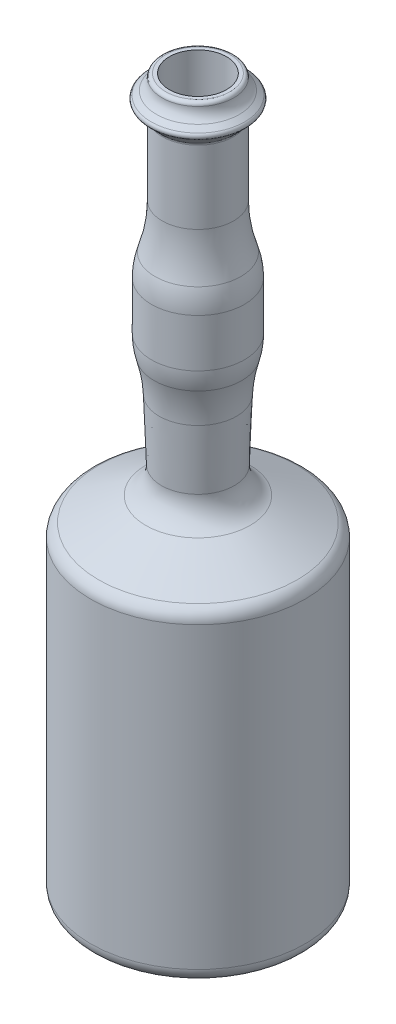
ISO-10303-21;
HEADER;
FILE_DESCRIPTION(('STEP AP214'),'2;1');
FILE_NAME('part.step','',(''),(''),'','','');
FILE_SCHEMA(('AUTOMOTIVE_DESIGN { 1 0 10303 214 1 1 1 1 }'));
ENDSEC;
DATA;
#1=APPLICATION_CONTEXT('core data for automotive mechanical design processes');
#2=APPLICATION_PROTOCOL_DEFINITION('international standard','automotive_design',2000,#1);
#3=PRODUCT_CONTEXT('',#1,'mechanical');
#4=PRODUCT('Part','Part','',(#3));
#5=PRODUCT_RELATED_PRODUCT_CATEGORY('part','',(#4));
#6=PRODUCT_DEFINITION_FORMATION('','',#4);
#7=PRODUCT_DEFINITION_CONTEXT('part definition',#1,'design');
#8=PRODUCT_DEFINITION('design','',#6,#7);
#9=PRODUCT_DEFINITION_SHAPE('','',#8);
#10=(LENGTH_UNIT() NAMED_UNIT(*) SI_UNIT(.MILLI.,.METRE.));
#11=(NAMED_UNIT(*) PLANE_ANGLE_UNIT() SI_UNIT($,.RADIAN.));
#12=(NAMED_UNIT(*) SI_UNIT($,.STERADIAN.) SOLID_ANGLE_UNIT());
#13=UNCERTAINTY_MEASURE_WITH_UNIT(LENGTH_MEASURE(1.E-05),#10,'distance_accuracy_value','');
#14=(GEOMETRIC_REPRESENTATION_CONTEXT(3) GLOBAL_UNCERTAINTY_ASSIGNED_CONTEXT((#13)) GLOBAL_UNIT_ASSIGNED_CONTEXT((#10,
#11,#12)) REPRESENTATION_CONTEXT('',''));
#15=CARTESIAN_POINT('',(0.,0.,0.));
#16=DIRECTION('',(0.,0.,1.));
#17=DIRECTION('',(1.,0.,0.));
#18=AXIS2_PLACEMENT_3D('',#15,#16,#17);
#19=CARTESIAN_POINT('',(0.,0.,0.));
#20=DIRECTION('',(0.,1.,0.));
#21=DIRECTION('',(0.,0.,1.));
#22=AXIS2_PLACEMENT_3D('',#19,#20,#21);
#23=PLANE('',#22);
#24=CARTESIAN_POINT('',(0.,0.,0.));
#25=DIRECTION('',(0.,1.,0.));
#26=DIRECTION('',(0.,0.,1.));
#27=AXIS2_PLACEMENT_3D('',#24,#25,#26);
#28=CIRCLE('',#27,13.);
#29=CARTESIAN_POINT('',(0.,0.,13.));
#30=VERTEX_POINT('',#29);
#31=EDGE_CURVE('E190',#30,#30,#28,.F.);
#32=ORIENTED_EDGE('',*,*,#31,.T.);
#33=EDGE_LOOP('',(#32));
#34=FACE_BOUND('',#33,.T.);
#35=ADVANCED_FACE('F61',(#34),#23,.F.);
#36=CARTESIAN_POINT('',(0.,0.,0.));
#37=DIRECTION('',(0.,1.,0.));
#38=DIRECTION('',(0.,0.,1.));
#39=AXIS2_PLACEMENT_3D('',#36,#37,#38);
#40=CYLINDRICAL_SURFACE('',#39,15.);
#41=CARTESIAN_POINT('',(0.,43.7639320225002,0.));
#42=DIRECTION('',(0.,-1.,0.));
#43=DIRECTION('',(0.,0.,-1.));
#44=AXIS2_PLACEMENT_3D('',#41,#42,#43);
#45=CIRCLE('',#44,15.);
#46=CARTESIAN_POINT('',(0.,43.7639320225002,-15.));
#47=VERTEX_POINT('',#46);
#48=EDGE_CURVE('E194',#47,#47,#45,.T.);
#49=ORIENTED_EDGE('',*,*,#48,.T.);
#50=EDGE_LOOP('',(#49));
#51=FACE_BOUND('',#50,.T.);
#52=CARTESIAN_POINT('',(0.,2.,0.));
#53=DIRECTION('',(0.,1.,0.));
#54=DIRECTION('',(0.,0.,1.));
#55=AXIS2_PLACEMENT_3D('',#52,#53,#54);
#56=CIRCLE('',#55,15.);
#57=CARTESIAN_POINT('',(0.,2.,15.));
#58=VERTEX_POINT('',#57);
#59=EDGE_CURVE('E229',#58,#58,#56,.T.);
#60=ORIENTED_EDGE('',*,*,#59,.T.);
#61=EDGE_LOOP('',(#60));
#62=FACE_BOUND('',#61,.T.);
#63=ADVANCED_FACE('F151',(#51,#62),#40,.T.);
#64=CARTESIAN_POINT('',(0.,50.,0.));
#65=DIRECTION('',(0.,-1.,0.));
#66=DIRECTION('',(0.,0.,-1.));
#67=AXIS2_PLACEMENT_3D('',#64,#65,#66);
#68=CONICAL_SURFACE('',#67,5.,1.10714871779409);
#69=CARTESIAN_POINT('',(0.,48.8498036512811,0.));
#70=DIRECTION('',(0.,-1.,0.));
#71=DIRECTION('',(0.,0.,-1.));
#72=AXIS2_PLACEMENT_3D('',#69,#70,#71);
#73=CIRCLE('',#72,7.30039269743788);
#74=CARTESIAN_POINT('',(0.,48.8498036512811,-7.30039269743788));
#75=VERTEX_POINT('',#74);
#76=EDGE_CURVE('E185',#75,#75,#73,.T.);
#77=ORIENTED_EDGE('',*,*,#76,.T.);
#78=EDGE_LOOP('',(#77));
#79=FACE_BOUND('',#78,.T.);
#80=CARTESIAN_POINT('',(0.,45.5527864045,0.));
#81=DIRECTION('',(0.,1.,0.));
#82=DIRECTION('',(0.,0.,1.));
#83=AXIS2_PLACEMENT_3D('',#80,#81,#82);
#84=CIRCLE('',#83,13.8944271909999);
#85=CARTESIAN_POINT('',(0.,45.5527864045,13.8944271909999));
#86=VERTEX_POINT('',#85);
#87=EDGE_CURVE('E227',#86,#86,#84,.T.);
#88=ORIENTED_EDGE('',*,*,#87,.T.);
#89=EDGE_LOOP('',(#88));
#90=FACE_BOUND('',#89,.T.);
#91=ADVANCED_FACE('F157',(#79,#90),#68,.T.);
#92=CARTESIAN_POINT('',(0.,50.,0.));
#93=DIRECTION('',(0.,1.,0.));
#94=DIRECTION('',(0.,0.,1.));
#95=AXIS2_PLACEMENT_3D('',#92,#93,#94);
#96=CONICAL_SURFACE('',#95,5.,0.0356991126793239);
#97=CARTESIAN_POINT('',(0.,61.1216545078617,0.));
#98=DIRECTION('',(0.,1.,0.));
#99=DIRECTION('',(0.,0.,1.));
#100=AXIS2_PLACEMENT_3D('',#97,#98,#99);
#101=CIRCLE('',#100,5.39720194670935);
#102=CARTESIAN_POINT('',(0.,61.1216545078617,5.39720194670935));
#103=VERTEX_POINT('',#102);
#104=EDGE_CURVE('E192',#103,#103,#101,.F.);
#105=ORIENTED_EDGE('',*,*,#104,.T.);
#106=EDGE_LOOP('',(#105));
#107=FACE_BOUND('',#106,.T.);
#108=CARTESIAN_POINT('',(0.,52.5702785373304,0.));
#109=DIRECTION('',(0.,1.,0.));
#110=DIRECTION('',(0.,0.,1.));
#111=AXIS2_PLACEMENT_3D('',#108,#109,#110);
#112=CIRCLE('',#111,5.09179566204751);
#113=CARTESIAN_POINT('',(0.,52.5702785373304,5.09179566204751));
#114=VERTEX_POINT('',#113);
#115=EDGE_CURVE('E188',#114,#114,#112,.T.);
#116=ORIENTED_EDGE('',*,*,#115,.T.);
#117=EDGE_LOOP('',(#116));
#118=FACE_BOUND('',#117,.T.);
#119=ADVANCED_FACE('F168',(#107,#118),#96,.T.);
#120=CARTESIAN_POINT('',(0.,43.7639320225002,0.));
#121=DIRECTION('',(0.,-1.,0.));
#122=DIRECTION('',(0.,0.,-1.));
#123=AXIS2_PLACEMENT_3D('',#120,#121,#122);
#124=TOROIDAL_SURFACE('',#123,13.,2.);
#125=ORIENTED_EDGE('',*,*,#48,.F.);
#126=EDGE_LOOP('',(#125));
#127=FACE_BOUND('',#126,.T.);
#128=ORIENTED_EDGE('',*,*,#87,.F.);
#129=EDGE_LOOP('',(#128));
#130=FACE_BOUND('',#129,.T.);
#131=ADVANCED_FACE('F164',(#127,#130),#124,.T.);
#132=CARTESIAN_POINT('',(0.,2.,0.));
#133=DIRECTION('',(0.,1.,0.));
#134=DIRECTION('',(0.,0.,1.));
#135=AXIS2_PLACEMENT_3D('',#132,#133,#134);
#136=TOROIDAL_SURFACE('',#135,13.,2.);
#137=ORIENTED_EDGE('',*,*,#31,.F.);
#138=EDGE_LOOP('',(#137));
#139=FACE_BOUND('',#138,.T.);
#140=ORIENTED_EDGE('',*,*,#59,.F.);
#141=EDGE_LOOP('',(#140));
#142=FACE_BOUND('',#141,.T.);
#143=ADVANCED_FACE('F167',(#139,#142),#136,.T.);
#144=CARTESIAN_POINT('',(0.,67.,0.));
#145=DIRECTION('',(0.,1.,0.));
#146=DIRECTION('',(0.,0.,1.));
#147=AXIS2_PLACEMENT_3D('',#144,#145,#146);
#148=CYLINDRICAL_SURFACE('',#147,6.5);
#149=CARTESIAN_POINT('',(0.,68.5126389067792,0.));
#150=DIRECTION('',(0.,-1.,0.));
#151=DIRECTION('',(0.,0.,-1.));
#152=AXIS2_PLACEMENT_3D('',#149,#150,#151);
#153=CIRCLE('',#152,6.5);
#154=CARTESIAN_POINT('',(0.,68.5126389067792,-6.5));
#155=VERTEX_POINT('',#154);
#156=EDGE_CURVE('E68',#155,#155,#153,.F.);
#157=ORIENTED_EDGE('',*,*,#156,.T.);
#158=EDGE_LOOP('',(#157));
#159=FACE_BOUND('',#158,.T.);
#160=CARTESIAN_POINT('',(0.,75.2318450791878,0.));
#161=DIRECTION('',(0.,-1.,0.));
#162=DIRECTION('',(0.,0.,-1.));
#163=AXIS2_PLACEMENT_3D('',#160,#161,#162);
#164=CIRCLE('',#163,6.5);
#165=CARTESIAN_POINT('',(0.,75.2318450791878,-6.5));
#166=VERTEX_POINT('',#165);
#167=EDGE_CURVE('E96',#166,#166,#164,.T.);
#168=ORIENTED_EDGE('',*,*,#167,.T.);
#169=EDGE_LOOP('',(#168));
#170=FACE_BOUND('',#169,.T.);
#171=ADVANCED_FACE('F171',(#159,#170),#148,.T.);
#172=CARTESIAN_POINT('',(0.,52.4275124152807,0.));
#173=DIRECTION('',(0.,1.,0.));
#174=DIRECTION('',(0.,0.,1.));
#175=AXIS2_PLACEMENT_3D('',#172,#173,#174);
#176=TOROIDAL_SURFACE('',#175,9.08924707943771,4.);
#177=ORIENTED_EDGE('',*,*,#76,.F.);
#178=EDGE_LOOP('',(#177));
#179=FACE_BOUND('',#178,.T.);
#180=ORIENTED_EDGE('',*,*,#115,.F.);
#181=EDGE_LOOP('',(#180));
#182=FACE_BOUND('',#181,.T.);
#183=ADVANCED_FACE('F173',(#179,#182),#176,.F.);
#184=CARTESIAN_POINT('',(0.,60.4078238976134,0.));
#185=DIRECTION('',(0.,1.,0.));
#186=DIRECTION('',(0.,0.,1.));
#187=AXIS2_PLACEMENT_3D('',#184,#185,#186);
#188=TOROIDAL_SURFACE('',#187,25.3844590336603,20.);
#189=CARTESIAN_POINT('',(0.,65.8110339037239,0.));
#190=DIRECTION('',(0.,-1.,0.));
#191=DIRECTION('',(0.,0.,-1.));
#192=AXIS2_PLACEMENT_3D('',#189,#190,#191);
#193=CIRCLE('',#192,6.12815301122012);
#194=CARTESIAN_POINT('',(0.,65.8110339037239,-6.12815301122012));
#195=VERTEX_POINT('',#194);
#196=EDGE_CURVE('E11',#195,#195,#193,.T.);
#197=ORIENTED_EDGE('',*,*,#196,.T.);
#198=EDGE_LOOP('',(#197));
#199=FACE_BOUND('',#198,.T.);
#200=ORIENTED_EDGE('',*,*,#104,.F.);
#201=EDGE_LOOP('',(#200));
#202=FACE_BOUND('',#201,.T.);
#203=ADVANCED_FACE('F122',(#199,#202),#188,.F.);
#204=CARTESIAN_POINT('',(0.,80.,0.));
#205=DIRECTION('',(0.,1.,0.));
#206=DIRECTION('',(0.,0.,1.));
#207=AXIS2_PLACEMENT_3D('',#204,#205,#206);
#208=CYLINDRICAL_SURFACE('',#207,5.);
#209=CARTESIAN_POINT('',(0.,94.8044922111821,0.));
#210=DIRECTION('',(0.,1.,0.));
#211=DIRECTION('',(0.,0.,1.));
#212=AXIS2_PLACEMENT_3D('',#209,#210,#211);
#213=CIRCLE('',#212,5.);
#214=CARTESIAN_POINT('',(0.,94.8044922111821,5.));
#215=VERTEX_POINT('',#214);
#216=EDGE_CURVE('E76',#215,#215,#213,.F.);
#217=ORIENTED_EDGE('',*,*,#216,.T.);
#218=EDGE_LOOP('',(#217));
#219=FACE_BOUND('',#218,.T.);
#220=CARTESIAN_POINT('',(0.,84.5993420767853,0.));
#221=DIRECTION('',(0.,1.,0.));
#222=DIRECTION('',(0.,0.,1.));
#223=AXIS2_PLACEMENT_3D('',#220,#221,#222);
#224=CIRCLE('',#223,5.);
#225=CARTESIAN_POINT('',(0.,84.5993420767853,5.));
#226=VERTEX_POINT('',#225);
#227=EDGE_CURVE('E102',#226,#226,#224,.T.);
#228=ORIENTED_EDGE('',*,*,#227,.T.);
#229=EDGE_LOOP('',(#228));
#230=FACE_BOUND('',#229,.T.);
#231=ADVANCED_FACE('F120',(#219,#230),#208,.T.);
#232=CARTESIAN_POINT('',(0.,84.5993420767853,0.));
#233=DIRECTION('',(0.,-1.,0.));
#234=DIRECTION('',(0.,0.,-1.));
#235=AXIS2_PLACEMENT_3D('',#232,#233,#234);
#236=TOROIDAL_SURFACE('',#235,25.,20.);
#237=CARTESIAN_POINT('',(0.,78.354344078387,0.));
#238=DIRECTION('',(0.,1.,0.));
#239=DIRECTION('',(0.,0.,1.));
#240=AXIS2_PLACEMENT_3D('',#237,#238,#239);
#241=CIRCLE('',#240,6.);
#242=CARTESIAN_POINT('',(0.,78.354344078387,6.));
#243=VERTEX_POINT('',#242);
#244=EDGE_CURVE('E99',#243,#243,#241,.T.);
#245=ORIENTED_EDGE('',*,*,#244,.T.);
#246=EDGE_LOOP('',(#245));
#247=FACE_BOUND('',#246,.T.);
#248=ORIENTED_EDGE('',*,*,#227,.F.);
#249=EDGE_LOOP('',(#248));
#250=FACE_BOUND('',#249,.T.);
#251=ADVANCED_FACE('F109',(#247,#250),#236,.F.);
#252=CARTESIAN_POINT('',(0.,75.2318450791878,0.));
#253=DIRECTION('',(0.,-1.,0.));
#254=DIRECTION('',(0.,0.,-1.));
#255=AXIS2_PLACEMENT_3D('',#252,#253,#254);
#256=DEGENERATE_TOROIDAL_SURFACE('',#255,3.5,10.,.F.);
#257=ORIENTED_EDGE('',*,*,#167,.F.);
#258=EDGE_LOOP('',(#257));
#259=FACE_BOUND('',#258,.T.);
#260=ORIENTED_EDGE('',*,*,#244,.F.);
#261=EDGE_LOOP('',(#260));
#262=FACE_BOUND('',#261,.T.);
#263=ADVANCED_FACE('F119',(#259,#262),#256,.F.);
#264=CARTESIAN_POINT('',(6.95787828317773,97.,-0.766765802891455));
#265=CARTESIAN_POINT('',(4.96911137244617,95.,0.554916361469131));
#266=CARTESIAN_POINT('',(8.49140988896064,97.,13.148990763464));
#267=CARTESIAN_POINT('',(3.85927864950791,95.,10.4931391063615));
#268=CARTESIAN_POINT('',(-5.42434667739482,97.,14.6825223692469));
#269=CARTESIAN_POINT('',(-6.07894409538443,95.,9.38330638342321));
#270=CARTESIAN_POINT('',(-6.95787828317773,97.,0.766765802891455));
#271=CARTESIAN_POINT('',(-4.96911137244617,95.,-0.554916361469132));
#272=CARTESIAN_POINT('',(-8.49140988896064,97.,-13.148990763464));
#273=CARTESIAN_POINT('',(-3.85927864950791,95.,-10.4931391063615));
#274=CARTESIAN_POINT('',(5.42434667739482,97.,-14.6825223692469));
#275=CARTESIAN_POINT('',(6.07894409538443,95.,-9.38330638342321));
#276=CARTESIAN_POINT('',(6.95787828317773,97.,-0.766765802891455));
#277=CARTESIAN_POINT('',(4.96911137244617,95.,0.554916361469131));
#278=(BOUNDED_SURFACE() B_SPLINE_SURFACE(3,1,((#264,#265),(#266,#267),(#268,#269),(#270,#271),
(#272,#273),(#274,#275),(#276,#277)),.UNSPECIFIED.,.T.,.F.,.F.) B_SPLINE_SURFACE_WITH_KNOTS((4,
3,4),(2,2),(0.,0.5,1.),(0.,1.),
.UNSPECIFIED.) GEOMETRIC_REPRESENTATION_ITEM() RATIONAL_B_SPLINE_SURFACE(((1.,1.),
(0.333333333333333,0.333333333333333),(0.333333333333333,0.333333333333333),(1.,1.),
(0.333333333333333,0.333333333333333),(0.333333333333333,0.333333333333333),(1.,1.))) REPRESENTATION_ITEM('') SURFACE());
#279=CARTESIAN_POINT('',(0.,96.5941117168195,0.));
#280=DIRECTION('',(0.,-1.,0.));
#281=DIRECTION('',(0.,0.,-1.));
#282=AXIS2_PLACEMENT_3D('',#279,#280,#281);
#283=CIRCLE('',#282,6.57320252634436);
#284=CARTESIAN_POINT('',(6.55426968965621,96.5941117168195,-0.498538150590147));
#285=VERTEX_POINT('',#284);
#286=EDGE_CURVE('E81',#285,#285,#283,.T.);
#287=CARTESIAN_POINT('',(0.,95.1452598366395,0.));
#288=DIRECTION('',(0.,-1.,0.));
#289=DIRECTION('',(0.,0.,-1.));
#290=AXIS2_PLACEMENT_3D('',#287,#288,#289);
#291=CIRCLE('',#290,5.13410735804045);
#292=CARTESIAN_POINT('',(5.11355535072966,95.1452598366395,0.458922693826928));
#293=VERTEX_POINT('',#292);
#294=EDGE_CURVE('E84',#293,#293,#291,.F.);
#295=CARTESIAN_POINT('',(6.55426968965621,96.5941117168195,-0.498538150590147));
#296=CARTESIAN_POINT('',(6.53926224862572,96.5790195097343,-0.488564600127468));
#297=CARTESIAN_POINT('',(6.52425480759524,96.5639273026491,-0.478591049664791));
#298=CARTESIAN_POINT('',(6.49423992553427,96.5337428884787,-0.458643948739436));
#299=CARTESIAN_POINT('',(6.47923248450379,96.5186506813935,-0.448670398276759));
#300=CARTESIAN_POINT('',(6.44921760244282,96.488466267223,-0.428723297351402));
#301=CARTESIAN_POINT('',(6.43421016141233,96.4733740601378,-0.418749746888723));
#302=CARTESIAN_POINT('',(6.40419527935136,96.4431896459674,-0.398802645963367));
#303=CARTESIAN_POINT('',(6.38918783832088,96.4280974388822,-0.388829095500691));
#304=CARTESIAN_POINT('',(6.35917295625991,96.3979130247118,-0.368881994575336));
#305=CARTESIAN_POINT('',(6.34416551522942,96.3828208176266,-0.358908444112658));
#306=CARTESIAN_POINT('',(6.31415063316845,96.3526364034562,-0.338961343187301));
#307=CARTESIAN_POINT('',(6.29914319213797,96.337544196371,-0.328987792724623));
#308=CARTESIAN_POINT('',(6.269128310077,96.3073597822005,-0.309040691799267));
#309=CARTESIAN_POINT('',(6.25412086904651,96.2922675751153,-0.29906714133659));
#310=CARTESIAN_POINT('',(6.22410598698554,96.2620831609449,-0.279120040411235));
#311=CARTESIAN_POINT('',(6.20909854595506,96.2469909538597,-0.269146489948556));
#312=CARTESIAN_POINT('',(6.17908366389409,96.2168065396893,-0.2491993890232));
#313=CARTESIAN_POINT('',(6.1640762228636,96.2017143326041,-0.239225838560522));
#314=CARTESIAN_POINT('',(6.13406134080263,96.1715299184337,-0.219278737635168));
#315=CARTESIAN_POINT('',(6.11905389977215,96.1564377113485,-0.20930518717249));
#316=CARTESIAN_POINT('',(6.08903901771118,96.1262532971781,-0.189358086247133));
#317=CARTESIAN_POINT('',(6.07403157668069,96.1111610900928,-0.179384535784454));
#318=CARTESIAN_POINT('',(6.04401669461972,96.0809766759224,-0.159437434859099));
#319=CARTESIAN_POINT('',(6.02900925358924,96.0658844688372,-0.149463884396423));
#320=CARTESIAN_POINT('',(5.99899437152827,96.0357000546668,-0.129516783471067));
#321=CARTESIAN_POINT('',(5.98398693049778,96.0206078475816,-0.119543233008387));
#322=CARTESIAN_POINT('',(5.95397204843681,95.9904234334112,-0.0995961320830312));
#323=CARTESIAN_POINT('',(5.93896460740633,95.975331226326,-0.0896225816203554));
#324=CARTESIAN_POINT('',(5.90894972534536,95.9451468121555,-0.0696754806950009));
#325=CARTESIAN_POINT('',(5.89394228431488,95.9300546050703,-0.0597019302323221));
#326=CARTESIAN_POINT('',(5.8639274022539,95.8998701908999,-0.0397548293069646));
#327=CARTESIAN_POINT('',(5.84891996122342,95.8847779838147,-0.0297812788442858));
#328=CARTESIAN_POINT('',(5.81890507916245,95.8545935696443,-0.00983417791893101));
#329=CARTESIAN_POINT('',(5.80389763813197,95.8395013625591,0.000139372543744924));
#330=CARTESIAN_POINT('',(5.773882756071,95.8093169483887,0.0200864734691004));
#331=CARTESIAN_POINT('',(5.75887531504051,95.7942247413035,0.0300600239317798));
#332=CARTESIAN_POINT('',(5.72886043297954,95.7640403271331,0.0500071248571365));
#333=CARTESIAN_POINT('',(5.71385299194906,95.7489481200478,0.0599806753198136));
#334=CARTESIAN_POINT('',(5.68383810988809,95.7187637058774,0.0799277762451688));
#335=CARTESIAN_POINT('',(5.6688306688576,95.7036714987922,0.0899013267078468));
#336=CARTESIAN_POINT('',(5.63881578679663,95.6734870846218,0.109848427633203));
#337=CARTESIAN_POINT('',(5.62380834576615,95.6583948775366,0.119821978095881));
#338=CARTESIAN_POINT('',(5.59379346370518,95.6282104633662,0.139769079021236));
#339=CARTESIAN_POINT('',(5.57878602267469,95.613118256281,0.149742629483913));
#340=CARTESIAN_POINT('',(5.54877114061372,95.5829338421106,0.169689730409269));
#341=CARTESIAN_POINT('',(5.53376369958324,95.5678416350253,0.179663280871948));
#342=CARTESIAN_POINT('',(5.50374881752227,95.5376572208549,0.199610381797304));
#343=CARTESIAN_POINT('',(5.48874137649178,95.5225650137697,0.209583932259981));
#344=CARTESIAN_POINT('',(5.45872649443081,95.4923805995993,0.229531033185336));
#345=CARTESIAN_POINT('',(5.44371905340033,95.4772883925141,0.239504583648015));
#346=CARTESIAN_POINT('',(5.41370417133936,95.4471039783437,0.259451684573371));
#347=CARTESIAN_POINT('',(5.39869673030887,95.4320117712585,0.269425235036049));
#348=CARTESIAN_POINT('',(5.3686818482479,95.4018273570881,0.289372335961404));
#349=CARTESIAN_POINT('',(5.35367440721742,95.3867351500029,0.299345886424082));
#350=CARTESIAN_POINT('',(5.32365952515645,95.3565507358324,0.319292987349438));
#351=CARTESIAN_POINT('',(5.30865208412597,95.3414585287472,0.329266537812115));
#352=CARTESIAN_POINT('',(5.278637202065,95.3112741145768,0.349213638737471));
#353=CARTESIAN_POINT('',(5.26362976103451,95.2961819074916,0.35918718920015));
#354=CARTESIAN_POINT('',(5.23361487897354,95.2659974933212,0.379134290125506));
#355=CARTESIAN_POINT('',(5.21860743794305,95.250905286236,0.389107840588183));
#356=CARTESIAN_POINT('',(5.18859255588209,95.2207208720656,0.409054941513538));
#357=CARTESIAN_POINT('',(5.1735851148516,95.2056286649804,0.419028491976216));
#358=CARTESIAN_POINT('',(5.14357023279063,95.17544425081,0.438975592901572));
#359=CARTESIAN_POINT('',(5.12856279176015,95.1603520437247,0.44894914336425));
#360=CARTESIAN_POINT('',(5.11355535072966,95.1452598366395,0.458922693826928));
#361=B_SPLINE_CURVE_WITH_KNOTS('',3,(#295,#296,#297,#298,#299,#300,#301,#302,#303,#304,#305,
#306,#307,#308,#309,#310,#311,#312,#313,#314,#315,#316,#317,#318,#319,#320,#321,#322,#323,#324,
#325,#326,#327,#328,#329,#330,#331,#332,#333,#334,#335,#336,#337,#338,#339,#340,#341,#342,#343,
#344,#345,#346,#347,#348,#349,#350,#351,#352,#353,#354,#355,#356,#357,#358,#359,#360),
.UNSPECIFIED.,.F.,.F.,(4,2,2,2,2,2,2,2,2,2,2,2,2,2,2,2,2,2,2,2,2,2,2,2,2,2,2,2,2,2,2,2,4),(0.,
0.0705140226363602,0.14102804527272,0.211542067909071,0.28205609054544,0.3525701131818,
0.423084135818151,0.493598158454511,0.564112181090861,0.634626203727221,0.705140226363581,
0.775654248999932,0.846168271636301,0.916682294272653,0.987196316909021,1.05771033954537,
1.12822436218172,1.19873838481809,1.26925240745444,1.3397664300908,1.41028045272716,
1.48079447536352,1.55130849799988,1.62182252063623,1.69233654327259,1.76285056590894,
1.8333645885453,1.90387861118166,1.97439263381802,2.04490665645438,2.11542067909074,
2.1859347017271,2.25644872436345),.UNSPECIFIED.);
#362=EDGE_CURVE('BSEAM126',#285,#293,#361,.T.);
#363=ORIENTED_EDGE('',*,*,#286,.T.);
#364=ORIENTED_EDGE('',*,*,#294,.T.);
#365=ORIENTED_EDGE('',*,*,#362,.T.);
#366=ORIENTED_EDGE('',*,*,#362,.F.);
#367=EDGE_LOOP('',(#363,#365,#364,#366));
#368=FACE_BOUND('',#367,.T.);
#369=ADVANCED_FACE('F126',(#368),#278,.T.);
#370=CARTESIAN_POINT('',(0.,98.5,0.));
#371=DIRECTION('',(0.,-1.,0.));
#372=DIRECTION('',(0.,0.,-1.));
#373=AXIS2_PLACEMENT_3D('',#370,#371,#372);
#374=CONICAL_SURFACE('',#373,5.,0.927295218001612);
#375=CARTESIAN_POINT('',(0.,97.9,0.));
#376=DIRECTION('',(0.,-1.,0.));
#377=DIRECTION('',(0.,0.,-1.));
#378=AXIS2_PLACEMENT_3D('',#375,#376,#377);
#379=CIRCLE('',#378,5.8);
#380=CARTESIAN_POINT('',(0.,97.9,-5.8));
#381=VERTEX_POINT('',#380);
#382=EDGE_CURVE('E72',#381,#381,#379,.T.);
#383=ORIENTED_EDGE('',*,*,#382,.T.);
#384=EDGE_LOOP('',(#383));
#385=FACE_BOUND('',#384,.T.);
#386=CARTESIAN_POINT('',(0.,97.3548009778594,0.));
#387=DIRECTION('',(0.,1.,0.));
#388=DIRECTION('',(0.,0.,1.));
#389=AXIS2_PLACEMENT_3D('',#386,#387,#388);
#390=CIRCLE('',#389,6.52693202952076);
#391=CARTESIAN_POINT('',(0.,97.3548009778594,6.52693202952076));
#392=VERTEX_POINT('',#391);
#393=EDGE_CURVE('E87',#392,#392,#390,.T.);
#394=ORIENTED_EDGE('',*,*,#393,.T.);
#395=EDGE_LOOP('',(#394));
#396=FACE_BOUND('',#395,.T.);
#397=ADVANCED_FACE('F369',(#385,#396),#374,.T.);
#398=CARTESIAN_POINT('',(0.,100.,0.));
#399=DIRECTION('',(0.,1.,0.));
#400=DIRECTION('',(0.,0.,1.));
#401=AXIS2_PLACEMENT_3D('',#398,#399,#400);
#402=PLANE('',#401);
#403=CARTESIAN_POINT('',(0.,100.,0.));
#404=DIRECTION('',(0.,1.,0.));
#405=DIRECTION('',(0.,0.,1.));
#406=AXIS2_PLACEMENT_3D('',#403,#404,#405);
#407=CIRCLE('',#406,4.5);
#408=CARTESIAN_POINT('',(0.,100.,4.5));
#409=VERTEX_POINT('',#408);
#410=EDGE_CURVE('E93',#409,#409,#407,.T.);
#411=ORIENTED_EDGE('',*,*,#410,.T.);
#412=EDGE_LOOP('',(#411));
#413=FACE_BOUND('',#412,.T.);
#414=CARTESIAN_POINT('',(0.,100.,0.));
#415=DIRECTION('',(0.,1.,0.));
#416=DIRECTION('',(0.,0.,1.));
#417=AXIS2_PLACEMENT_3D('',#414,#415,#416);
#418=CIRCLE('',#417,4.);
#419=CARTESIAN_POINT('',(0.,100.,4.));
#420=VERTEX_POINT('',#419);
#421=EDGE_CURVE('E238',#420,#420,#418,.T.);
#422=ORIENTED_EDGE('',*,*,#421,.F.);
#423=EDGE_LOOP('',(#422));
#424=FACE_BOUND('',#423,.T.);
#425=ADVANCED_FACE('F214',(#413,#424),#402,.T.);
#426=CARTESIAN_POINT('',(0.,80.,0.));
#427=DIRECTION('',(0.,1.,0.));
#428=DIRECTION('',(0.,0.,1.));
#429=AXIS2_PLACEMENT_3D('',#426,#427,#428);
#430=CYLINDRICAL_SURFACE('',#429,4.);
#431=ORIENTED_EDGE('',*,*,#421,.T.);
#432=EDGE_LOOP('',(#431));
#433=FACE_BOUND('',#432,.T.);
#434=CARTESIAN_POINT('',(0.,84.5993420767853,0.));
#435=DIRECTION('',(0.,1.,0.));
#436=DIRECTION('',(0.,0.,1.));
#437=AXIS2_PLACEMENT_3D('',#434,#435,#436);
#438=CIRCLE('',#437,4.);
#439=CARTESIAN_POINT('',(0.,84.5993420767853,4.));
#440=VERTEX_POINT('',#439);
#441=EDGE_CURVE('E247',#440,#440,#438,.T.);
#442=ORIENTED_EDGE('',*,*,#441,.F.);
#443=EDGE_LOOP('',(#442));
#444=FACE_BOUND('',#443,.T.);
#445=ADVANCED_FACE('F284',(#433,#444),#430,.F.);
#446=CARTESIAN_POINT('',(0.,1.,0.));
#447=DIRECTION('',(0.,1.,0.));
#448=DIRECTION('',(0.,0.,1.));
#449=AXIS2_PLACEMENT_3D('',#446,#447,#448);
#450=PLANE('',#449);
#451=CARTESIAN_POINT('',(0.,1.,0.));
#452=DIRECTION('',(0.,1.,0.));
#453=DIRECTION('',(0.,0.,1.));
#454=AXIS2_PLACEMENT_3D('',#451,#452,#453);
#455=CIRCLE('',#454,13.);
#456=CARTESIAN_POINT('',(0.,1.,13.));
#457=VERTEX_POINT('',#456);
#458=EDGE_CURVE('E265',#457,#457,#455,.F.);
#459=ORIENTED_EDGE('',*,*,#458,.F.);
#460=EDGE_LOOP('',(#459));
#461=FACE_BOUND('',#460,.T.);
#462=ADVANCED_FACE('F282',(#461),#450,.T.);
#463=CARTESIAN_POINT('',(0.,2.,0.));
#464=DIRECTION('',(0.,1.,0.));
#465=DIRECTION('',(0.,0.,1.));
#466=AXIS2_PLACEMENT_3D('',#463,#464,#465);
#467=TOROIDAL_SURFACE('',#466,13.,1.);
#468=ORIENTED_EDGE('',*,*,#458,.T.);
#469=EDGE_LOOP('',(#468));
#470=FACE_BOUND('',#469,.T.);
#471=CARTESIAN_POINT('',(0.,2.,0.));
#472=DIRECTION('',(0.,1.,0.));
#473=DIRECTION('',(0.,0.,1.));
#474=AXIS2_PLACEMENT_3D('',#471,#472,#473);
#475=CIRCLE('',#474,14.);
#476=CARTESIAN_POINT('',(0.,2.,14.));
#477=VERTEX_POINT('',#476);
#478=EDGE_CURVE('E270',#477,#477,#475,.T.);
#479=ORIENTED_EDGE('',*,*,#478,.T.);
#480=EDGE_LOOP('',(#479));
#481=FACE_BOUND('',#480,.T.);
#482=ADVANCED_FACE('F279',(#470,#481),#467,.F.);
#483=CARTESIAN_POINT('',(0.,0.,0.));
#484=DIRECTION('',(0.,1.,0.));
#485=DIRECTION('',(0.,0.,1.));
#486=AXIS2_PLACEMENT_3D('',#483,#484,#485);
#487=CYLINDRICAL_SURFACE('',#486,14.);
#488=CARTESIAN_POINT('',(0.,43.7639320225002,0.));
#489=DIRECTION('',(0.,1.,0.));
#490=DIRECTION('',(0.,0.,1.));
#491=AXIS2_PLACEMENT_3D('',#488,#489,#490);
#492=CIRCLE('',#491,14.);
#493=CARTESIAN_POINT('',(0.,43.7639320225002,14.));
#494=VERTEX_POINT('',#493);
#495=EDGE_CURVE('E271',#494,#494,#492,.F.);
#496=ORIENTED_EDGE('',*,*,#495,.F.);
#497=EDGE_LOOP('',(#496));
#498=FACE_BOUND('',#497,.T.);
#499=ORIENTED_EDGE('',*,*,#478,.F.);
#500=EDGE_LOOP('',(#499));
#501=FACE_BOUND('',#500,.T.);
#502=ADVANCED_FACE('F290',(#498,#501),#487,.F.);
#503=CARTESIAN_POINT('',(0.,43.7639320225002,0.));
#504=DIRECTION('',(0.,-1.,0.));
#505=DIRECTION('',(0.,0.,-1.));
#506=AXIS2_PLACEMENT_3D('',#503,#504,#505);
#507=TOROIDAL_SURFACE('',#506,13.,1.);
#508=ORIENTED_EDGE('',*,*,#495,.T.);
#509=EDGE_LOOP('',(#508));
#510=FACE_BOUND('',#509,.T.);
#511=CARTESIAN_POINT('',(0.,44.6583592135001,0.));
#512=DIRECTION('',(0.,-1.,0.));
#513=DIRECTION('',(0.,0.,-1.));
#514=AXIS2_PLACEMENT_3D('',#511,#512,#513);
#515=CIRCLE('',#514,13.4472135955);
#516=CARTESIAN_POINT('',(0.,44.6583592135001,-13.4472135955));
#517=VERTEX_POINT('',#516);
#518=EDGE_CURVE('E255',#517,#517,#515,.F.);
#519=ORIENTED_EDGE('',*,*,#518,.T.);
#520=EDGE_LOOP('',(#519));
#521=FACE_BOUND('',#520,.T.);
#522=ADVANCED_FACE('F301',(#510,#521),#507,.F.);
#523=CARTESIAN_POINT('',(0.,49.1055728090001,0.));
#524=DIRECTION('',(0.,-1.,0.));
#525=DIRECTION('',(0.,0.,-1.));
#526=AXIS2_PLACEMENT_3D('',#523,#524,#525);
#527=CONICAL_SURFACE('',#526,4.55278640450004,1.10714871779409);
#528=CARTESIAN_POINT('',(0.,47.9553764602811,0.));
#529=DIRECTION('',(0.,-1.,0.));
#530=DIRECTION('',(0.,0.,-1.));
#531=AXIS2_PLACEMENT_3D('',#528,#529,#530);
#532=CIRCLE('',#531,6.85317910193793);
#533=CARTESIAN_POINT('',(0.,47.9553764602811,-6.85317910193793));
#534=VERTEX_POINT('',#533);
#535=EDGE_CURVE('E259',#534,#534,#532,.T.);
#536=ORIENTED_EDGE('',*,*,#535,.F.);
#537=EDGE_LOOP('',(#536));
#538=FACE_BOUND('',#537,.T.);
#539=ORIENTED_EDGE('',*,*,#518,.F.);
#540=EDGE_LOOP('',(#539));
#541=FACE_BOUND('',#540,.T.);
#542=ADVANCED_FACE('F303',(#538,#541),#527,.F.);
#543=CARTESIAN_POINT('',(0.,52.4275124152807,0.));
#544=DIRECTION('',(0.,1.,0.));
#545=DIRECTION('',(0.,0.,1.));
#546=AXIS2_PLACEMENT_3D('',#543,#544,#545);
#547=TOROIDAL_SURFACE('',#546,9.08924707943771,5.);
#548=ORIENTED_EDGE('',*,*,#535,.T.);
#549=EDGE_LOOP('',(#548));
#550=FACE_BOUND('',#549,.T.);
#551=CARTESIAN_POINT('',(0.,52.6059700678428,0.));
#552=DIRECTION('',(0.,1.,0.));
#553=DIRECTION('',(0.,0.,1.));
#554=AXIS2_PLACEMENT_3D('',#551,#552,#553);
#555=CIRCLE('',#554,4.09243280769996);
#556=CARTESIAN_POINT('',(0.,52.6059700678428,4.09243280769996));
#557=VERTEX_POINT('',#556);
#558=EDGE_CURVE('E262',#557,#557,#555,.T.);
#559=ORIENTED_EDGE('',*,*,#558,.T.);
#560=EDGE_LOOP('',(#559));
#561=FACE_BOUND('',#560,.T.);
#562=ADVANCED_FACE('F306',(#550,#561),#547,.T.);
#563=CARTESIAN_POINT('',(0.,50.0356915305124,0.));
#564=DIRECTION('',(0.,1.,0.));
#565=DIRECTION('',(0.,0.,1.));
#566=AXIS2_PLACEMENT_3D('',#563,#564,#565);
#567=CONICAL_SURFACE('',#566,4.00063714565245,0.0356991126793239);
#568=CARTESIAN_POINT('',(0.,61.1573460383741,0.));
#569=DIRECTION('',(0.,1.,0.));
#570=DIRECTION('',(0.,0.,1.));
#571=AXIS2_PLACEMENT_3D('',#568,#569,#570);
#572=CIRCLE('',#571,4.3978390923618);
#573=CARTESIAN_POINT('',(0.,61.1573460383741,4.3978390923618));
#574=VERTEX_POINT('',#573);
#575=EDGE_CURVE('E250',#574,#574,#572,.F.);
#576=ORIENTED_EDGE('',*,*,#575,.F.);
#577=EDGE_LOOP('',(#576));
#578=FACE_BOUND('',#577,.T.);
#579=ORIENTED_EDGE('',*,*,#558,.F.);
#580=EDGE_LOOP('',(#579));
#581=FACE_BOUND('',#580,.T.);
#582=ADVANCED_FACE('F308',(#578,#581),#567,.F.);
#583=CARTESIAN_POINT('',(0.,60.4078238976134,0.));
#584=DIRECTION('',(0.,1.,0.));
#585=DIRECTION('',(0.,0.,1.));
#586=AXIS2_PLACEMENT_3D('',#583,#584,#585);
#587=TOROIDAL_SURFACE('',#586,25.3844590336603,21.);
#588=ORIENTED_EDGE('',*,*,#575,.T.);
#589=EDGE_LOOP('',(#588));
#590=FACE_BOUND('',#589,.T.);
#591=CARTESIAN_POINT('',(0.,67.048606983967,0.));
#592=DIRECTION('',(0.,1.,0.));
#593=DIRECTION('',(0.,0.,1.));
#594=AXIS2_PLACEMENT_3D('',#591,#592,#593);
#595=CIRCLE('',#594,5.46210977459955);
#596=CARTESIAN_POINT('',(0.,67.048606983967,5.46210977459955));
#597=VERTEX_POINT('',#596);
#598=EDGE_CURVE('E256',#597,#597,#595,.T.);
#599=ORIENTED_EDGE('',*,*,#598,.T.);
#600=EDGE_LOOP('',(#599));
#601=FACE_BOUND('',#600,.T.);
#602=ADVANCED_FACE('F311',(#590,#601),#587,.T.);
#603=CARTESIAN_POINT('',(0.,64.3162277660168,0.));
#604=DIRECTION('',(0.,1.,0.));
#605=DIRECTION('',(0.,0.,1.));
#606=AXIS2_PLACEMENT_3D('',#603,#604,#605);
#607=CONICAL_SURFACE('',#606,4.55131670194949,0.321750554396642);
#608=ORIENTED_EDGE('',*,*,#598,.F.);
#609=EDGE_LOOP('',(#608));
#610=FACE_BOUND('',#609,.T.);
#611=CARTESIAN_POINT('',(0.,67.1622776601684,0.));
#612=DIRECTION('',(0.,1.,0.));
#613=DIRECTION('',(0.,0.,1.));
#614=AXIS2_PLACEMENT_3D('',#611,#612,#613);
#615=CIRCLE('',#614,5.5);
#616=CARTESIAN_POINT('',(0.,67.1622776601684,5.5));
#617=VERTEX_POINT('',#616);
#618=EDGE_CURVE('E246',#617,#617,#615,.T.);
#619=ORIENTED_EDGE('',*,*,#618,.T.);
#620=EDGE_LOOP('',(#619));
#621=FACE_BOUND('',#620,.T.);
#622=ADVANCED_FACE('F316',(#610,#621),#607,.F.);
#623=CARTESIAN_POINT('',(0.,67.,0.));
#624=DIRECTION('',(0.,1.,0.));
#625=DIRECTION('',(0.,0.,1.));
#626=AXIS2_PLACEMENT_3D('',#623,#624,#625);
#627=CYLINDRICAL_SURFACE('',#626,5.5);
#628=CARTESIAN_POINT('',(0.,75.2318450791878,0.));
#629=DIRECTION('',(0.,1.,0.));
#630=DIRECTION('',(0.,0.,1.));
#631=AXIS2_PLACEMENT_3D('',#628,#629,#630);
#632=CIRCLE('',#631,5.5);
#633=CARTESIAN_POINT('',(0.,75.2318450791878,5.5));
#634=VERTEX_POINT('',#633);
#635=EDGE_CURVE('E230',#634,#634,#632,.F.);
#636=ORIENTED_EDGE('',*,*,#635,.F.);
#637=EDGE_LOOP('',(#636));
#638=FACE_BOUND('',#637,.T.);
#639=ORIENTED_EDGE('',*,*,#618,.F.);
#640=EDGE_LOOP('',(#639));
#641=FACE_BOUND('',#640,.T.);
#642=ADVANCED_FACE('F319',(#638,#641),#627,.F.);
#643=CARTESIAN_POINT('',(0.,75.2318450791878,0.));
#644=DIRECTION('',(0.,-1.,0.));
#645=DIRECTION('',(0.,0.,-1.));
#646=AXIS2_PLACEMENT_3D('',#643,#644,#645);
#647=DEGENERATE_TOROIDAL_SURFACE('',#646,3.5,9.,.F.);
#648=ORIENTED_EDGE('',*,*,#635,.T.);
#649=EDGE_LOOP('',(#648));
#650=FACE_BOUND('',#649,.T.);
#651=CARTESIAN_POINT('',(0.,78.042094178467,0.));
#652=DIRECTION('',(0.,-1.,0.));
#653=DIRECTION('',(0.,0.,-1.));
#654=AXIS2_PLACEMENT_3D('',#651,#652,#653);
#655=CIRCLE('',#654,5.05);
#656=CARTESIAN_POINT('',(0.,78.042094178467,-5.05));
#657=VERTEX_POINT('',#656);
#658=EDGE_CURVE('E235',#657,#657,#655,.F.);
#659=ORIENTED_EDGE('',*,*,#658,.T.);
#660=EDGE_LOOP('',(#659));
#661=FACE_BOUND('',#660,.T.);
#662=ADVANCED_FACE('F323',(#650,#661),#647,.T.);
#663=CARTESIAN_POINT('',(0.,84.5993420767853,0.));
#664=DIRECTION('',(0.,-1.,0.));
#665=DIRECTION('',(0.,0.,-1.));
#666=AXIS2_PLACEMENT_3D('',#663,#664,#665);
#667=TOROIDAL_SURFACE('',#666,25.,21.);
#668=ORIENTED_EDGE('',*,*,#658,.F.);
#669=EDGE_LOOP('',(#668));
#670=FACE_BOUND('',#669,.T.);
#671=ORIENTED_EDGE('',*,*,#441,.T.);
#672=EDGE_LOOP('',(#671));
#673=FACE_BOUND('',#672,.T.);
#674=ADVANCED_FACE('F132',(#670,#673),#667,.T.);
#675=CARTESIAN_POINT('',(0.,99.5,0.));
#676=DIRECTION('',(0.,1.,0.));
#677=DIRECTION('',(0.,0.,1.));
#678=AXIS2_PLACEMENT_3D('',#675,#676,#677);
#679=TOROIDAL_SURFACE('',#678,4.5,0.5);
#680=CARTESIAN_POINT('',(0.,99.5,0.));
#681=DIRECTION('',(0.,1.,0.));
#682=DIRECTION('',(0.,0.,1.));
#683=AXIS2_PLACEMENT_3D('',#680,#681,#682);
#684=CIRCLE('',#683,5.);
#685=CARTESIAN_POINT('',(0.,99.5,5.));
#686=VERTEX_POINT('',#685);
#687=EDGE_CURVE('E90',#686,#686,#684,.F.);
#688=ORIENTED_EDGE('',*,*,#687,.F.);
#689=EDGE_LOOP('',(#688));
#690=FACE_BOUND('',#689,.T.);
#691=ORIENTED_EDGE('',*,*,#410,.F.);
#692=EDGE_LOOP('',(#691));
#693=FACE_BOUND('',#692,.T.);
#694=ADVANCED_FACE('F128',(#690,#693),#679,.T.);
#695=CARTESIAN_POINT('',(0.,96.9548009778594,0.));
#696=DIRECTION('',(0.,-1.,0.));
#697=DIRECTION('',(0.,0.,-1.));
#698=AXIS2_PLACEMENT_3D('',#695,#696,#697);
#699=TOROIDAL_SURFACE('',#698,6.22693202952076,0.5);
#700=ORIENTED_EDGE('',*,*,#286,.F.);
#701=EDGE_LOOP('',(#700));
#702=FACE_BOUND('',#701,.T.);
#703=ORIENTED_EDGE('',*,*,#393,.F.);
#704=EDGE_LOOP('',(#703));
#705=FACE_BOUND('',#704,.T.);
#706=ADVANCED_FACE('F131',(#702,#705),#699,.T.);
#707=CARTESIAN_POINT('',(0.,94.8044922111821,0.));
#708=DIRECTION('',(0.,1.,0.));
#709=DIRECTION('',(0.,0.,1.));
#710=AXIS2_PLACEMENT_3D('',#707,#708,#709);
#711=TOROIDAL_SURFACE('',#710,5.5,0.5);
#712=ORIENTED_EDGE('',*,*,#216,.F.);
#713=EDGE_LOOP('',(#712));
#714=FACE_BOUND('',#713,.T.);
#715=ORIENTED_EDGE('',*,*,#294,.F.);
#716=EDGE_LOOP('',(#715));
#717=FACE_BOUND('',#716,.T.);
#718=ADVANCED_FACE('F136',(#714,#717),#711,.F.);
#719=CARTESIAN_POINT('',(0.,99.5,0.));
#720=DIRECTION('',(0.,-1.,0.));
#721=DIRECTION('',(0.,0.,-1.));
#722=AXIS2_PLACEMENT_3D('',#719,#720,#721);
#723=TOROIDAL_SURFACE('',#722,7.,2.);
#724=ORIENTED_EDGE('',*,*,#687,.T.);
#725=EDGE_LOOP('',(#724));
#726=FACE_BOUND('',#725,.T.);
#727=ORIENTED_EDGE('',*,*,#382,.F.);
#728=EDGE_LOOP('',(#727));
#729=FACE_BOUND('',#728,.T.);
#730=ADVANCED_FACE('F139',(#726,#729),#723,.F.);
#731=CARTESIAN_POINT('',(0.,68.5126389067792,0.));
#732=DIRECTION('',(0.,-1.,0.));
#733=DIRECTION('',(0.,0.,-1.));
#734=AXIS2_PLACEMENT_3D('',#731,#732,#733);
#735=DEGENERATE_TOROIDAL_SURFACE('',#734,3.5,10.,.F.);
#736=ORIENTED_EDGE('',*,*,#196,.F.);
#737=EDGE_LOOP('',(#736));
#738=FACE_BOUND('',#737,.T.);
#739=ORIENTED_EDGE('',*,*,#156,.F.);
#740=EDGE_LOOP('',(#739));
#741=FACE_BOUND('',#740,.T.);
#742=ADVANCED_FACE('F63',(#738,#741),#735,.F.);
#743=CLOSED_SHELL('',(#35,#63,#91,#119,#131,#143,#171,#183,#203,#231,#251,#263,#369,#397,#425,
#445,#462,#482,#502,#522,#542,#562,#582,#602,#622,#642,#662,#674,#694,#706,#718,#730,#742));
#744=MANIFOLD_SOLID_BREP('B2',#743);
#745=ADVANCED_BREP_SHAPE_REPRESENTATION('',(#18,#744),#14);
#746=SHAPE_DEFINITION_REPRESENTATION(#9,#745);
ENDSEC;
END-ISO-10303-21;
